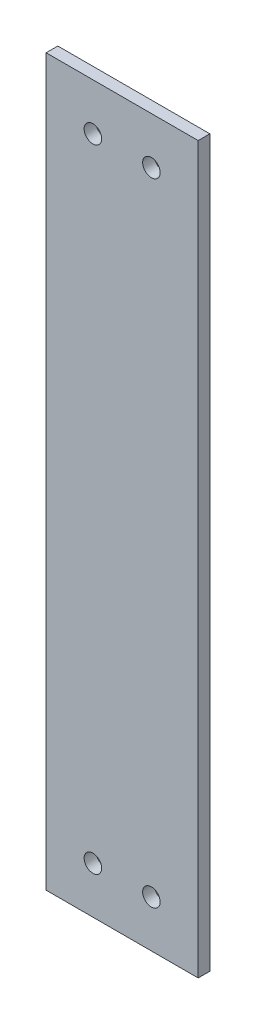
ISO-10303-21;
HEADER;
FILE_DESCRIPTION(('STEP AP214'),'2;1');
FILE_NAME('part.step','',(''),(''),'','','');
FILE_SCHEMA(('AUTOMOTIVE_DESIGN { 1 0 10303 214 1 1 1 1 }'));
ENDSEC;
DATA;
#1=APPLICATION_CONTEXT('core data for automotive mechanical design processes');
#2=APPLICATION_PROTOCOL_DEFINITION('international standard','automotive_design',2000,#1);
#3=PRODUCT_CONTEXT('',#1,'mechanical');
#4=PRODUCT('Part','Part','',(#3));
#5=PRODUCT_RELATED_PRODUCT_CATEGORY('part','',(#4));
#6=PRODUCT_DEFINITION_FORMATION('','',#4);
#7=PRODUCT_DEFINITION_CONTEXT('part definition',#1,'design');
#8=PRODUCT_DEFINITION('design','',#6,#7);
#9=PRODUCT_DEFINITION_SHAPE('','',#8);
#10=(LENGTH_UNIT() NAMED_UNIT(*) SI_UNIT(.MILLI.,.METRE.));
#11=(NAMED_UNIT(*) PLANE_ANGLE_UNIT() SI_UNIT($,.RADIAN.));
#12=(NAMED_UNIT(*) SI_UNIT($,.STERADIAN.) SOLID_ANGLE_UNIT());
#13=UNCERTAINTY_MEASURE_WITH_UNIT(LENGTH_MEASURE(1.E-05),#10,'distance_accuracy_value','');
#14=(GEOMETRIC_REPRESENTATION_CONTEXT(3) GLOBAL_UNCERTAINTY_ASSIGNED_CONTEXT((#13)) GLOBAL_UNIT_ASSIGNED_CONTEXT((#10,
#11,#12)) REPRESENTATION_CONTEXT('',''));
#15=CARTESIAN_POINT('',(0.,0.,0.));
#16=DIRECTION('',(0.,0.,1.));
#17=DIRECTION('',(1.,0.,0.));
#18=AXIS2_PLACEMENT_3D('',#15,#16,#17);
#19=CARTESIAN_POINT('',(0.,0.,2.));
#20=DIRECTION('',(0.,0.,-1.));
#21=DIRECTION('',(-1.,0.,0.));
#22=AXIS2_PLACEMENT_3D('',#19,#20,#21);
#23=PLANE('',#22);
#24=DIRECTION('',(0.,-1.,0.));
#25=VECTOR('',#24,1.);
#26=CARTESIAN_POINT('',(0.,0.,2.));
#27=LINE('',#26,#25);
#28=CARTESIAN_POINT('',(0.,124.,2.));
#29=VERTEX_POINT('',#28);
#30=CARTESIAN_POINT('',(0.,0.,2.));
#31=VERTEX_POINT('',#30);
#32=EDGE_CURVE('E92',#29,#31,#27,.T.);
#33=ORIENTED_EDGE('',*,*,#32,.T.);
#34=DIRECTION('',(1.,0.,0.));
#35=VECTOR('',#34,1.);
#36=CARTESIAN_POINT('',(0.,0.,2.));
#37=LINE('',#36,#35);
#38=CARTESIAN_POINT('',(26.,0.,2.));
#39=VERTEX_POINT('',#38);
#40=EDGE_CURVE('E87',#31,#39,#37,.T.);
#41=ORIENTED_EDGE('',*,*,#40,.T.);
#42=DIRECTION('',(0.,1.,0.));
#43=VECTOR('',#42,1.);
#44=CARTESIAN_POINT('',(26.,0.,2.));
#45=LINE('',#44,#43);
#46=CARTESIAN_POINT('',(26.,124.,2.));
#47=VERTEX_POINT('',#46);
#48=EDGE_CURVE('E90',#39,#47,#45,.T.);
#49=ORIENTED_EDGE('',*,*,#48,.T.);
#50=DIRECTION('',(-1.,0.,0.));
#51=VECTOR('',#50,1.);
#52=CARTESIAN_POINT('',(0.,124.,2.));
#53=LINE('',#52,#51);
#54=EDGE_CURVE('E57',#47,#29,#53,.T.);
#55=ORIENTED_EDGE('',*,*,#54,.T.);
#56=EDGE_LOOP('',(#33,#41,#49,#55));
#57=FACE_BOUND('',#56,.T.);
#58=CARTESIAN_POINT('',(8.,8.,2.));
#59=DIRECTION('',(0.,0.,1.));
#60=DIRECTION('',(1.,0.,0.));
#61=AXIS2_PLACEMENT_3D('',#58,#59,#60);
#62=CIRCLE('',#61,1.5);
#63=CARTESIAN_POINT('',(9.5,8.,2.));
#64=VERTEX_POINT('',#63);
#65=EDGE_CURVE('E112',#64,#64,#62,.T.);
#66=ORIENTED_EDGE('',*,*,#65,.F.);
#67=EDGE_LOOP('',(#66));
#68=FACE_BOUND('',#67,.T.);
#69=CARTESIAN_POINT('',(18.,8.,2.));
#70=DIRECTION('',(0.,0.,1.));
#71=DIRECTION('',(1.,0.,0.));
#72=AXIS2_PLACEMENT_3D('',#69,#70,#71);
#73=CIRCLE('',#72,1.5);
#74=CARTESIAN_POINT('',(19.5,8.,2.));
#75=VERTEX_POINT('',#74);
#76=EDGE_CURVE('E134',#75,#75,#73,.T.);
#77=ORIENTED_EDGE('',*,*,#76,.F.);
#78=EDGE_LOOP('',(#77));
#79=FACE_BOUND('',#78,.T.);
#80=CARTESIAN_POINT('',(18.,116.,2.));
#81=DIRECTION('',(0.,0.,1.));
#82=DIRECTION('',(1.,0.,0.));
#83=AXIS2_PLACEMENT_3D('',#80,#81,#82);
#84=CIRCLE('',#83,1.5);
#85=CARTESIAN_POINT('',(19.5,116.,2.));
#86=VERTEX_POINT('',#85);
#87=EDGE_CURVE('E142',#86,#86,#84,.T.);
#88=ORIENTED_EDGE('',*,*,#87,.F.);
#89=EDGE_LOOP('',(#88));
#90=FACE_BOUND('',#89,.T.);
#91=CARTESIAN_POINT('',(8.,116.,2.));
#92=DIRECTION('',(0.,0.,1.));
#93=DIRECTION('',(1.,0.,0.));
#94=AXIS2_PLACEMENT_3D('',#91,#92,#93);
#95=CIRCLE('',#94,1.5);
#96=CARTESIAN_POINT('',(9.5,116.,2.));
#97=VERTEX_POINT('',#96);
#98=EDGE_CURVE('E150',#97,#97,#95,.T.);
#99=ORIENTED_EDGE('',*,*,#98,.F.);
#100=EDGE_LOOP('',(#99));
#101=FACE_BOUND('',#100,.T.);
#102=ADVANCED_FACE('F39',(#57,#68,#79,#90,#101),#23,.F.);
#103=CARTESIAN_POINT('',(0.,0.,0.));
#104=DIRECTION('',(0.,0.,-1.));
#105=DIRECTION('',(-1.,0.,0.));
#106=AXIS2_PLACEMENT_3D('',#103,#104,#105);
#107=PLANE('',#106);
#108=CARTESIAN_POINT('',(18.,116.,0.));
#109=DIRECTION('',(0.,0.,1.));
#110=DIRECTION('',(1.,0.,0.));
#111=AXIS2_PLACEMENT_3D('',#108,#109,#110);
#112=CIRCLE('',#111,1.5);
#113=CARTESIAN_POINT('',(19.5,116.,0.));
#114=VERTEX_POINT('',#113);
#115=EDGE_CURVE('E146',#114,#114,#112,.T.);
#116=ORIENTED_EDGE('',*,*,#115,.T.);
#117=EDGE_LOOP('',(#116));
#118=FACE_BOUND('',#117,.T.);
#119=CARTESIAN_POINT('',(8.,8.,0.));
#120=DIRECTION('',(0.,0.,1.));
#121=DIRECTION('',(1.,0.,0.));
#122=AXIS2_PLACEMENT_3D('',#119,#120,#121);
#123=CIRCLE('',#122,1.5);
#124=CARTESIAN_POINT('',(9.5,8.,0.));
#125=VERTEX_POINT('',#124);
#126=EDGE_CURVE('E130',#125,#125,#123,.T.);
#127=ORIENTED_EDGE('',*,*,#126,.T.);
#128=EDGE_LOOP('',(#127));
#129=FACE_BOUND('',#128,.T.);
#130=DIRECTION('',(0.,-1.,0.));
#131=VECTOR('',#130,1.);
#132=CARTESIAN_POINT('',(0.,0.,0.));
#133=LINE('',#132,#131);
#134=CARTESIAN_POINT('',(0.,124.,0.));
#135=VERTEX_POINT('',#134);
#136=CARTESIAN_POINT('',(0.,0.,0.));
#137=VERTEX_POINT('',#136);
#138=EDGE_CURVE('E108',#135,#137,#133,.T.);
#139=ORIENTED_EDGE('',*,*,#138,.F.);
#140=DIRECTION('',(-1.,0.,0.));
#141=VECTOR('',#140,1.);
#142=CARTESIAN_POINT('',(0.,124.,0.));
#143=LINE('',#142,#141);
#144=CARTESIAN_POINT('',(26.,124.,0.));
#145=VERTEX_POINT('',#144);
#146=EDGE_CURVE('E80',#145,#135,#143,.T.);
#147=ORIENTED_EDGE('',*,*,#146,.F.);
#148=DIRECTION('',(0.,1.,0.));
#149=VECTOR('',#148,1.);
#150=CARTESIAN_POINT('',(26.,0.,0.));
#151=LINE('',#150,#149);
#152=CARTESIAN_POINT('',(26.,0.,0.));
#153=VERTEX_POINT('',#152);
#154=EDGE_CURVE('E74',#153,#145,#151,.T.);
#155=ORIENTED_EDGE('',*,*,#154,.F.);
#156=DIRECTION('',(1.,0.,0.));
#157=VECTOR('',#156,1.);
#158=CARTESIAN_POINT('',(0.,0.,0.));
#159=LINE('',#158,#157);
#160=EDGE_CURVE('E97',#137,#153,#159,.T.);
#161=ORIENTED_EDGE('',*,*,#160,.F.);
#162=EDGE_LOOP('',(#139,#147,#155,#161));
#163=FACE_BOUND('',#162,.T.);
#164=CARTESIAN_POINT('',(18.,8.,0.));
#165=DIRECTION('',(0.,0.,1.));
#166=DIRECTION('',(1.,0.,0.));
#167=AXIS2_PLACEMENT_3D('',#164,#165,#166);
#168=CIRCLE('',#167,1.5);
#169=CARTESIAN_POINT('',(19.5,8.,0.));
#170=VERTEX_POINT('',#169);
#171=EDGE_CURVE('E138',#170,#170,#168,.T.);
#172=ORIENTED_EDGE('',*,*,#171,.T.);
#173=EDGE_LOOP('',(#172));
#174=FACE_BOUND('',#173,.T.);
#175=CARTESIAN_POINT('',(8.,116.,0.));
#176=DIRECTION('',(0.,0.,1.));
#177=DIRECTION('',(1.,0.,0.));
#178=AXIS2_PLACEMENT_3D('',#175,#176,#177);
#179=CIRCLE('',#178,1.5);
#180=CARTESIAN_POINT('',(9.5,116.,0.));
#181=VERTEX_POINT('',#180);
#182=EDGE_CURVE('E154',#181,#181,#179,.T.);
#183=ORIENTED_EDGE('',*,*,#182,.T.);
#184=EDGE_LOOP('',(#183));
#185=FACE_BOUND('',#184,.T.);
#186=ADVANCED_FACE('F125',(#118,#129,#163,#174,#185),#107,.T.);
#187=CARTESIAN_POINT('',(0.,0.,2.));
#188=DIRECTION('',(1.,0.,0.));
#189=DIRECTION('',(0.,0.,-1.));
#190=AXIS2_PLACEMENT_3D('',#187,#188,#189);
#191=PLANE('',#190);
#192=ORIENTED_EDGE('',*,*,#138,.T.);
#193=DIRECTION('',(0.,0.,-1.));
#194=VECTOR('',#193,1.);
#195=CARTESIAN_POINT('',(0.,0.,2.));
#196=LINE('',#195,#194);
#197=EDGE_CURVE('E11',#31,#137,#196,.T.);
#198=ORIENTED_EDGE('',*,*,#197,.F.);
#199=ORIENTED_EDGE('',*,*,#32,.F.);
#200=DIRECTION('',(0.,0.,-1.));
#201=VECTOR('',#200,1.);
#202=CARTESIAN_POINT('',(0.,124.,2.));
#203=LINE('',#202,#201);
#204=EDGE_CURVE('E104',#29,#135,#203,.T.);
#205=ORIENTED_EDGE('',*,*,#204,.T.);
#206=EDGE_LOOP('',(#192,#198,#199,#205));
#207=FACE_BOUND('',#206,.T.);
#208=ADVANCED_FACE('F41',(#207),#191,.F.);
#209=CARTESIAN_POINT('',(0.,0.,2.));
#210=DIRECTION('',(0.,1.,0.));
#211=DIRECTION('',(0.,0.,1.));
#212=AXIS2_PLACEMENT_3D('',#209,#210,#211);
#213=PLANE('',#212);
#214=ORIENTED_EDGE('',*,*,#160,.T.);
#215=DIRECTION('',(0.,0.,-1.));
#216=VECTOR('',#215,1.);
#217=CARTESIAN_POINT('',(26.,0.,2.));
#218=LINE('',#217,#216);
#219=EDGE_CURVE('E49',#39,#153,#218,.T.);
#220=ORIENTED_EDGE('',*,*,#219,.F.);
#221=ORIENTED_EDGE('',*,*,#40,.F.);
#222=ORIENTED_EDGE('',*,*,#197,.T.);
#223=EDGE_LOOP('',(#214,#220,#221,#222));
#224=FACE_BOUND('',#223,.T.);
#225=ADVANCED_FACE('F96',(#224),#213,.F.);
#226=CARTESIAN_POINT('',(26.,0.,2.));
#227=DIRECTION('',(-1.,0.,0.));
#228=DIRECTION('',(0.,0.,1.));
#229=AXIS2_PLACEMENT_3D('',#226,#227,#228);
#230=PLANE('',#229);
#231=ORIENTED_EDGE('',*,*,#154,.T.);
#232=DIRECTION('',(0.,0.,-1.));
#233=VECTOR('',#232,1.);
#234=CARTESIAN_POINT('',(26.,124.,2.));
#235=LINE('',#234,#233);
#236=EDGE_CURVE('E99',#47,#145,#235,.T.);
#237=ORIENTED_EDGE('',*,*,#236,.F.);
#238=ORIENTED_EDGE('',*,*,#48,.F.);
#239=ORIENTED_EDGE('',*,*,#219,.T.);
#240=EDGE_LOOP('',(#231,#237,#238,#239));
#241=FACE_BOUND('',#240,.T.);
#242=ADVANCED_FACE('F100',(#241),#230,.F.);
#243=CARTESIAN_POINT('',(0.,124.,2.));
#244=DIRECTION('',(0.,-1.,0.));
#245=DIRECTION('',(0.,0.,-1.));
#246=AXIS2_PLACEMENT_3D('',#243,#244,#245);
#247=PLANE('',#246);
#248=ORIENTED_EDGE('',*,*,#146,.T.);
#249=ORIENTED_EDGE('',*,*,#204,.F.);
#250=ORIENTED_EDGE('',*,*,#54,.F.);
#251=ORIENTED_EDGE('',*,*,#236,.T.);
#252=EDGE_LOOP('',(#248,#249,#250,#251));
#253=FACE_BOUND('',#252,.T.);
#254=ADVANCED_FACE('F122',(#253),#247,.F.);
#255=CARTESIAN_POINT('',(8.,8.,2.));
#256=DIRECTION('',(0.,0.,-1.));
#257=DIRECTION('',(-1.,0.,0.));
#258=AXIS2_PLACEMENT_3D('',#255,#256,#257);
#259=CYLINDRICAL_SURFACE('',#258,1.5);
#260=ORIENTED_EDGE('',*,*,#65,.T.);
#261=EDGE_LOOP('',(#260));
#262=FACE_BOUND('',#261,.T.);
#263=ORIENTED_EDGE('',*,*,#126,.F.);
#264=EDGE_LOOP('',(#263));
#265=FACE_BOUND('',#264,.T.);
#266=ADVANCED_FACE('F173',(#262,#265),#259,.F.);
#267=CARTESIAN_POINT('',(18.,8.,2.));
#268=DIRECTION('',(0.,0.,-1.));
#269=DIRECTION('',(-1.,0.,0.));
#270=AXIS2_PLACEMENT_3D('',#267,#268,#269);
#271=CYLINDRICAL_SURFACE('',#270,1.5);
#272=ORIENTED_EDGE('',*,*,#76,.T.);
#273=EDGE_LOOP('',(#272));
#274=FACE_BOUND('',#273,.T.);
#275=ORIENTED_EDGE('',*,*,#171,.F.);
#276=EDGE_LOOP('',(#275));
#277=FACE_BOUND('',#276,.T.);
#278=ADVANCED_FACE('F219',(#274,#277),#271,.F.);
#279=CARTESIAN_POINT('',(18.,116.,2.));
#280=DIRECTION('',(0.,0.,-1.));
#281=DIRECTION('',(-1.,0.,0.));
#282=AXIS2_PLACEMENT_3D('',#279,#280,#281);
#283=CYLINDRICAL_SURFACE('',#282,1.5);
#284=ORIENTED_EDGE('',*,*,#87,.T.);
#285=EDGE_LOOP('',(#284));
#286=FACE_BOUND('',#285,.T.);
#287=ORIENTED_EDGE('',*,*,#115,.F.);
#288=EDGE_LOOP('',(#287));
#289=FACE_BOUND('',#288,.T.);
#290=ADVANCED_FACE('F227',(#286,#289),#283,.F.);
#291=CARTESIAN_POINT('',(8.,116.,2.));
#292=DIRECTION('',(0.,0.,-1.));
#293=DIRECTION('',(-1.,0.,0.));
#294=AXIS2_PLACEMENT_3D('',#291,#292,#293);
#295=CYLINDRICAL_SURFACE('',#294,1.5);
#296=ORIENTED_EDGE('',*,*,#98,.T.);
#297=EDGE_LOOP('',(#296));
#298=FACE_BOUND('',#297,.T.);
#299=ORIENTED_EDGE('',*,*,#182,.F.);
#300=EDGE_LOOP('',(#299));
#301=FACE_BOUND('',#300,.T.);
#302=ADVANCED_FACE('F162',(#298,#301),#295,.F.);
#303=CLOSED_SHELL('',(#102,#186,#208,#225,#242,#254,#266,#278,#290,#302));
#304=MANIFOLD_SOLID_BREP('B2',#303);
#305=ADVANCED_BREP_SHAPE_REPRESENTATION('',(#18,#304),#14);
#306=SHAPE_DEFINITION_REPRESENTATION(#9,#305);
ENDSEC;
END-ISO-10303-21;
